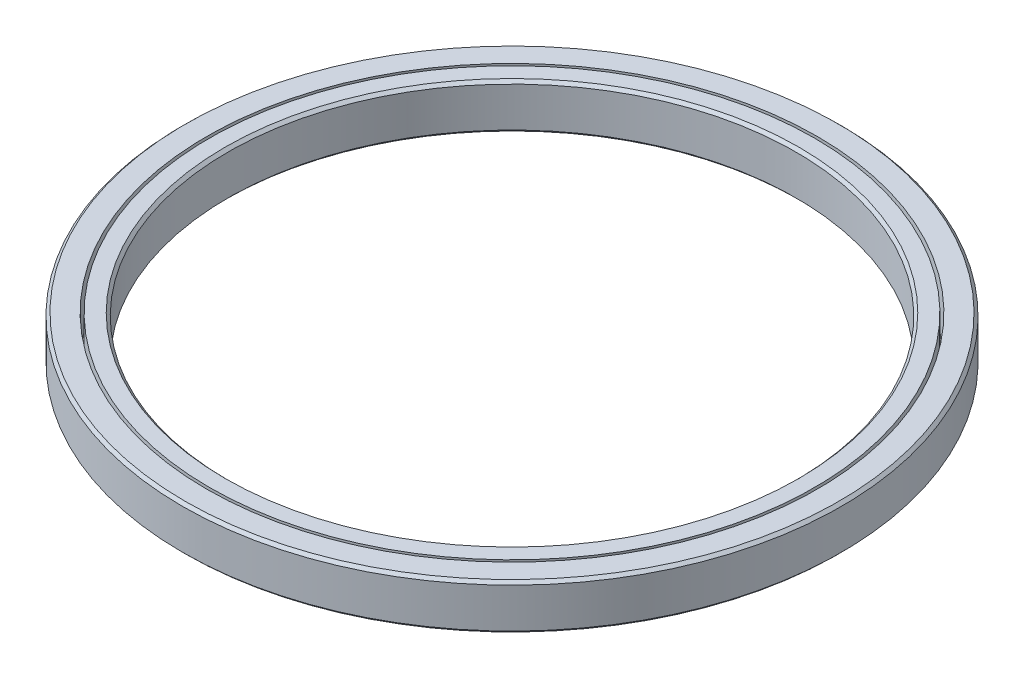
ISO-10303-21;
HEADER;
FILE_DESCRIPTION(('STEP AP214'),'2;1');
FILE_NAME('part.step','',(''),(''),'','','');
FILE_SCHEMA(('AUTOMOTIVE_DESIGN { 1 0 10303 214 1 1 1 1 }'));
ENDSEC;
DATA;
#1=APPLICATION_CONTEXT('core data for automotive mechanical design processes');
#2=APPLICATION_PROTOCOL_DEFINITION('international standard','automotive_design',2000,#1);
#3=PRODUCT_CONTEXT('',#1,'mechanical');
#4=PRODUCT('Part','Part','',(#3));
#5=PRODUCT_RELATED_PRODUCT_CATEGORY('part','',(#4));
#6=PRODUCT_DEFINITION_FORMATION('','',#4);
#7=PRODUCT_DEFINITION_CONTEXT('part definition',#1,'design');
#8=PRODUCT_DEFINITION('design','',#6,#7);
#9=PRODUCT_DEFINITION_SHAPE('','',#8);
#10=(LENGTH_UNIT() NAMED_UNIT(*) SI_UNIT(.MILLI.,.METRE.));
#11=(NAMED_UNIT(*) PLANE_ANGLE_UNIT() SI_UNIT($,.RADIAN.));
#12=(NAMED_UNIT(*) SI_UNIT($,.STERADIAN.) SOLID_ANGLE_UNIT());
#13=UNCERTAINTY_MEASURE_WITH_UNIT(LENGTH_MEASURE(1.E-05),#10,'distance_accuracy_value','');
#14=(GEOMETRIC_REPRESENTATION_CONTEXT(3) GLOBAL_UNCERTAINTY_ASSIGNED_CONTEXT((#13)) GLOBAL_UNIT_ASSIGNED_CONTEXT((#10,
#11,#12)) REPRESENTATION_CONTEXT('',''));
#15=CARTESIAN_POINT('',(0.,0.,0.));
#16=DIRECTION('',(0.,0.,1.));
#17=DIRECTION('',(1.,0.,0.));
#18=AXIS2_PLACEMENT_3D('',#15,#16,#17);
#19=CARTESIAN_POINT('',(0.,8.,0.));
#20=DIRECTION('',(0.,1.,0.));
#21=DIRECTION('',(0.,0.,1.));
#22=AXIS2_PLACEMENT_3D('',#19,#20,#21);
#23=PLANE('',#22);
#24=CARTESIAN_POINT('',(0.,8.,0.));
#25=DIRECTION('',(0.,1.,0.));
#26=DIRECTION('',(0.,0.,1.));
#27=AXIS2_PLACEMENT_3D('',#24,#25,#26);
#28=CIRCLE('',#27,50.5);
#29=CARTESIAN_POINT('',(0.,8.,50.5));
#30=VERTEX_POINT('',#29);
#31=EDGE_CURVE('E11',#30,#30,#28,.F.);
#32=ORIENTED_EDGE('',*,*,#31,.T.);
#33=EDGE_LOOP('',(#32));
#34=FACE_BOUND('',#33,.T.);
#35=CARTESIAN_POINT('',(0.,8.,0.));
#36=DIRECTION('',(0.,1.,0.));
#37=DIRECTION('',(0.,0.,1.));
#38=AXIS2_PLACEMENT_3D('',#35,#36,#37);
#39=CIRCLE('',#38,53.25);
#40=CARTESIAN_POINT('',(0.,8.,53.25));
#41=VERTEX_POINT('',#40);
#42=EDGE_CURVE('E62',#41,#41,#39,.T.);
#43=ORIENTED_EDGE('',*,*,#42,.T.);
#44=EDGE_LOOP('',(#43));
#45=FACE_BOUND('',#44,.T.);
#46=ADVANCED_FACE('F42',(#34,#45),#23,.T.);
#47=CARTESIAN_POINT('',(0.,0.,0.));
#48=DIRECTION('',(0.,1.,0.));
#49=DIRECTION('',(0.,0.,1.));
#50=AXIS2_PLACEMENT_3D('',#47,#48,#49);
#51=PLANE('',#50);
#52=CARTESIAN_POINT('',(0.,0.,0.));
#53=DIRECTION('',(0.,1.,0.));
#54=DIRECTION('',(0.,0.,1.));
#55=AXIS2_PLACEMENT_3D('',#52,#53,#54);
#56=CIRCLE('',#55,50.5);
#57=CARTESIAN_POINT('',(0.,0.,50.5));
#58=VERTEX_POINT('',#57);
#59=EDGE_CURVE('E57',#58,#58,#56,.T.);
#60=ORIENTED_EDGE('',*,*,#59,.T.);
#61=EDGE_LOOP('',(#60));
#62=FACE_BOUND('',#61,.T.);
#63=CARTESIAN_POINT('',(0.,0.,0.));
#64=DIRECTION('',(0.,1.,0.));
#65=DIRECTION('',(0.,0.,1.));
#66=AXIS2_PLACEMENT_3D('',#63,#64,#65);
#67=CIRCLE('',#66,53.25);
#68=CARTESIAN_POINT('',(0.,0.,53.25));
#69=VERTEX_POINT('',#68);
#70=EDGE_CURVE('E63',#69,#69,#67,.T.);
#71=ORIENTED_EDGE('',*,*,#70,.F.);
#72=EDGE_LOOP('',(#71));
#73=FACE_BOUND('',#72,.T.);
#74=ADVANCED_FACE('F74',(#62,#73),#51,.F.);
#75=CARTESIAN_POINT('',(0.,8.,0.));
#76=DIRECTION('',(0.,-1.,0.));
#77=DIRECTION('',(0.,0.,-1.));
#78=AXIS2_PLACEMENT_3D('',#75,#76,#77);
#79=CYLINDRICAL_SURFACE('',#78,53.25);
#80=ORIENTED_EDGE('',*,*,#42,.F.);
#81=EDGE_LOOP('',(#80));
#82=FACE_BOUND('',#81,.T.);
#83=ORIENTED_EDGE('',*,*,#70,.T.);
#84=EDGE_LOOP('',(#83));
#85=FACE_BOUND('',#84,.T.);
#86=ADVANCED_FACE('F70',(#82,#85),#79,.T.);
#87=CARTESIAN_POINT('',(0.,8.,0.));
#88=DIRECTION('',(0.,-1.,0.));
#89=DIRECTION('',(0.,0.,-1.));
#90=AXIS2_PLACEMENT_3D('',#87,#88,#89);
#91=CYLINDRICAL_SURFACE('',#90,50.);
#92=CARTESIAN_POINT('',(0.,0.499999999999994,0.));
#93=DIRECTION('',(0.,1.,0.));
#94=DIRECTION('',(0.,0.,1.));
#95=AXIS2_PLACEMENT_3D('',#92,#93,#94);
#96=CIRCLE('',#95,50.);
#97=CARTESIAN_POINT('',(0.,0.499999999999994,50.));
#98=VERTEX_POINT('',#97);
#99=EDGE_CURVE('E49',#98,#98,#96,.F.);
#100=ORIENTED_EDGE('',*,*,#99,.T.);
#101=EDGE_LOOP('',(#100));
#102=FACE_BOUND('',#101,.T.);
#103=CARTESIAN_POINT('',(0.,7.49999999999995,0.));
#104=DIRECTION('',(0.,1.,0.));
#105=DIRECTION('',(0.,0.,1.));
#106=AXIS2_PLACEMENT_3D('',#103,#104,#105);
#107=CIRCLE('',#106,50.);
#108=CARTESIAN_POINT('',(0.,7.49999999999995,50.));
#109=VERTEX_POINT('',#108);
#110=EDGE_CURVE('E53',#109,#109,#107,.T.);
#111=ORIENTED_EDGE('',*,*,#110,.T.);
#112=EDGE_LOOP('',(#111));
#113=FACE_BOUND('',#112,.T.);
#114=ADVANCED_FACE('F73',(#102,#113),#91,.F.);
#115=CARTESIAN_POINT('',(0.,0.,0.));
#116=DIRECTION('',(0.,-1.,0.));
#117=DIRECTION('',(0.,0.,-1.));
#118=AXIS2_PLACEMENT_3D('',#115,#116,#117);
#119=CONICAL_SURFACE('',#118,50.5,0.785398163397455);
#120=ORIENTED_EDGE('',*,*,#99,.F.);
#121=EDGE_LOOP('',(#120));
#122=FACE_BOUND('',#121,.T.);
#123=ORIENTED_EDGE('',*,*,#59,.F.);
#124=EDGE_LOOP('',(#123));
#125=FACE_BOUND('',#124,.T.);
#126=ADVANCED_FACE('F86',(#122,#125),#119,.F.);
#127=CARTESIAN_POINT('',(0.,7.49999999999995,0.));
#128=DIRECTION('',(0.,1.,0.));
#129=DIRECTION('',(0.,0.,1.));
#130=AXIS2_PLACEMENT_3D('',#127,#128,#129);
#131=CONICAL_SURFACE('',#130,50.,0.785398163397441);
#132=ORIENTED_EDGE('',*,*,#31,.F.);
#133=EDGE_LOOP('',(#132));
#134=FACE_BOUND('',#133,.T.);
#135=ORIENTED_EDGE('',*,*,#110,.F.);
#136=EDGE_LOOP('',(#135));
#137=FACE_BOUND('',#136,.T.);
#138=ADVANCED_FACE('F44',(#134,#137),#131,.F.);
#139=CLOSED_SHELL('',(#46,#74,#86,#114,#126,#138));
#140=MANIFOLD_SOLID_BREP('B2',#139);
#141=CARTESIAN_POINT('',(0.,8.,0.));
#142=DIRECTION('',(0.,1.,0.));
#143=DIRECTION('',(0.,0.,1.));
#144=AXIS2_PLACEMENT_3D('',#141,#142,#143);
#145=PLANE('',#144);
#146=CARTESIAN_POINT('',(0.,8.,0.));
#147=DIRECTION('',(0.,1.,0.));
#148=DIRECTION('',(0.,0.,1.));
#149=AXIS2_PLACEMENT_3D('',#146,#147,#148);
#150=CIRCLE('',#149,57.5);
#151=CARTESIAN_POINT('',(0.,8.,57.5));
#152=VERTEX_POINT('',#151);
#153=EDGE_CURVE('E41',#152,#152,#150,.T.);
#154=ORIENTED_EDGE('',*,*,#153,.T.);
#155=EDGE_LOOP('',(#154));
#156=FACE_BOUND('',#155,.T.);
#157=CARTESIAN_POINT('',(0.,8.,0.));
#158=DIRECTION('',(0.,1.,0.));
#159=DIRECTION('',(0.,0.,1.));
#160=AXIS2_PLACEMENT_3D('',#157,#158,#159);
#161=CIRCLE('',#160,53.75);
#162=CARTESIAN_POINT('',(0.,8.,53.75));
#163=VERTEX_POINT('',#162);
#164=EDGE_CURVE('E153',#163,#163,#161,.T.);
#165=ORIENTED_EDGE('',*,*,#164,.F.);
#166=EDGE_LOOP('',(#165));
#167=FACE_BOUND('',#166,.T.);
#168=ADVANCED_FACE('F133',(#156,#167),#145,.T.);
#169=CARTESIAN_POINT('',(0.,0.,0.));
#170=DIRECTION('',(0.,1.,0.));
#171=DIRECTION('',(0.,0.,1.));
#172=AXIS2_PLACEMENT_3D('',#169,#170,#171);
#173=PLANE('',#172);
#174=CARTESIAN_POINT('',(0.,0.,0.));
#175=DIRECTION('',(0.,1.,0.));
#176=DIRECTION('',(0.,0.,1.));
#177=AXIS2_PLACEMENT_3D('',#174,#175,#176);
#178=CIRCLE('',#177,57.5);
#179=CARTESIAN_POINT('',(0.,0.,57.5));
#180=VERTEX_POINT('',#179);
#181=EDGE_CURVE('E140',#180,#180,#178,.F.);
#182=ORIENTED_EDGE('',*,*,#181,.T.);
#183=EDGE_LOOP('',(#182));
#184=FACE_BOUND('',#183,.T.);
#185=CARTESIAN_POINT('',(0.,0.,0.));
#186=DIRECTION('',(0.,1.,0.));
#187=DIRECTION('',(0.,0.,1.));
#188=AXIS2_PLACEMENT_3D('',#185,#186,#187);
#189=CIRCLE('',#188,53.75);
#190=CARTESIAN_POINT('',(0.,0.,53.75));
#191=VERTEX_POINT('',#190);
#192=EDGE_CURVE('E154',#191,#191,#189,.T.);
#193=ORIENTED_EDGE('',*,*,#192,.T.);
#194=EDGE_LOOP('',(#193));
#195=FACE_BOUND('',#194,.T.);
#196=ADVANCED_FACE('F164',(#184,#195),#173,.F.);
#197=CARTESIAN_POINT('',(0.,8.,0.));
#198=DIRECTION('',(0.,-1.,0.));
#199=DIRECTION('',(0.,0.,-1.));
#200=AXIS2_PLACEMENT_3D('',#197,#198,#199);
#201=CYLINDRICAL_SURFACE('',#200,58.);
#202=CARTESIAN_POINT('',(0.,0.500000000000007,0.));
#203=DIRECTION('',(0.,1.,0.));
#204=DIRECTION('',(0.,0.,1.));
#205=AXIS2_PLACEMENT_3D('',#202,#203,#204);
#206=CIRCLE('',#205,58.);
#207=CARTESIAN_POINT('',(0.,0.500000000000007,58.));
#208=VERTEX_POINT('',#207);
#209=EDGE_CURVE('E144',#208,#208,#206,.T.);
#210=ORIENTED_EDGE('',*,*,#209,.T.);
#211=EDGE_LOOP('',(#210));
#212=FACE_BOUND('',#211,.T.);
#213=CARTESIAN_POINT('',(0.,7.50000000000001,0.));
#214=DIRECTION('',(0.,1.,0.));
#215=DIRECTION('',(0.,0.,1.));
#216=AXIS2_PLACEMENT_3D('',#213,#214,#215);
#217=CIRCLE('',#216,58.);
#218=CARTESIAN_POINT('',(0.,7.50000000000001,58.));
#219=VERTEX_POINT('',#218);
#220=EDGE_CURVE('E148',#219,#219,#217,.F.);
#221=ORIENTED_EDGE('',*,*,#220,.T.);
#222=EDGE_LOOP('',(#221));
#223=FACE_BOUND('',#222,.T.);
#224=ADVANCED_FACE('F169',(#212,#223),#201,.T.);
#225=CARTESIAN_POINT('',(0.,8.,0.));
#226=DIRECTION('',(0.,-1.,0.));
#227=DIRECTION('',(0.,0.,-1.));
#228=AXIS2_PLACEMENT_3D('',#225,#226,#227);
#229=CYLINDRICAL_SURFACE('',#228,53.75);
#230=ORIENTED_EDGE('',*,*,#164,.T.);
#231=EDGE_LOOP('',(#230));
#232=FACE_BOUND('',#231,.T.);
#233=ORIENTED_EDGE('',*,*,#192,.F.);
#234=EDGE_LOOP('',(#233));
#235=FACE_BOUND('',#234,.T.);
#236=ADVANCED_FACE('F160',(#232,#235),#229,.F.);
#237=CARTESIAN_POINT('',(0.,0.500000000000007,0.));
#238=DIRECTION('',(0.,1.,0.));
#239=DIRECTION('',(0.,0.,1.));
#240=AXIS2_PLACEMENT_3D('',#237,#238,#239);
#241=CONICAL_SURFACE('',#240,58.,0.785398163397455);
#242=ORIENTED_EDGE('',*,*,#181,.F.);
#243=EDGE_LOOP('',(#242));
#244=FACE_BOUND('',#243,.T.);
#245=ORIENTED_EDGE('',*,*,#209,.F.);
#246=EDGE_LOOP('',(#245));
#247=FACE_BOUND('',#246,.T.);
#248=ADVANCED_FACE('F175',(#244,#247),#241,.T.);
#249=CARTESIAN_POINT('',(0.,8.,0.));
#250=DIRECTION('',(0.,-1.,0.));
#251=DIRECTION('',(0.,0.,-1.));
#252=AXIS2_PLACEMENT_3D('',#249,#250,#251);
#253=CONICAL_SURFACE('',#252,57.5,0.785398163397441);
#254=ORIENTED_EDGE('',*,*,#220,.F.);
#255=EDGE_LOOP('',(#254));
#256=FACE_BOUND('',#255,.T.);
#257=ORIENTED_EDGE('',*,*,#153,.F.);
#258=EDGE_LOOP('',(#257));
#259=FACE_BOUND('',#258,.T.);
#260=ADVANCED_FACE('F135',(#256,#259),#253,.T.);
#261=CLOSED_SHELL('',(#168,#196,#224,#236,#248,#260));
#262=MANIFOLD_SOLID_BREP('B6',#261);
#263=ADVANCED_BREP_SHAPE_REPRESENTATION('',(#18,#140,#262),#14);
#264=SHAPE_DEFINITION_REPRESENTATION(#9,#263);
ENDSEC;
END-ISO-10303-21;
